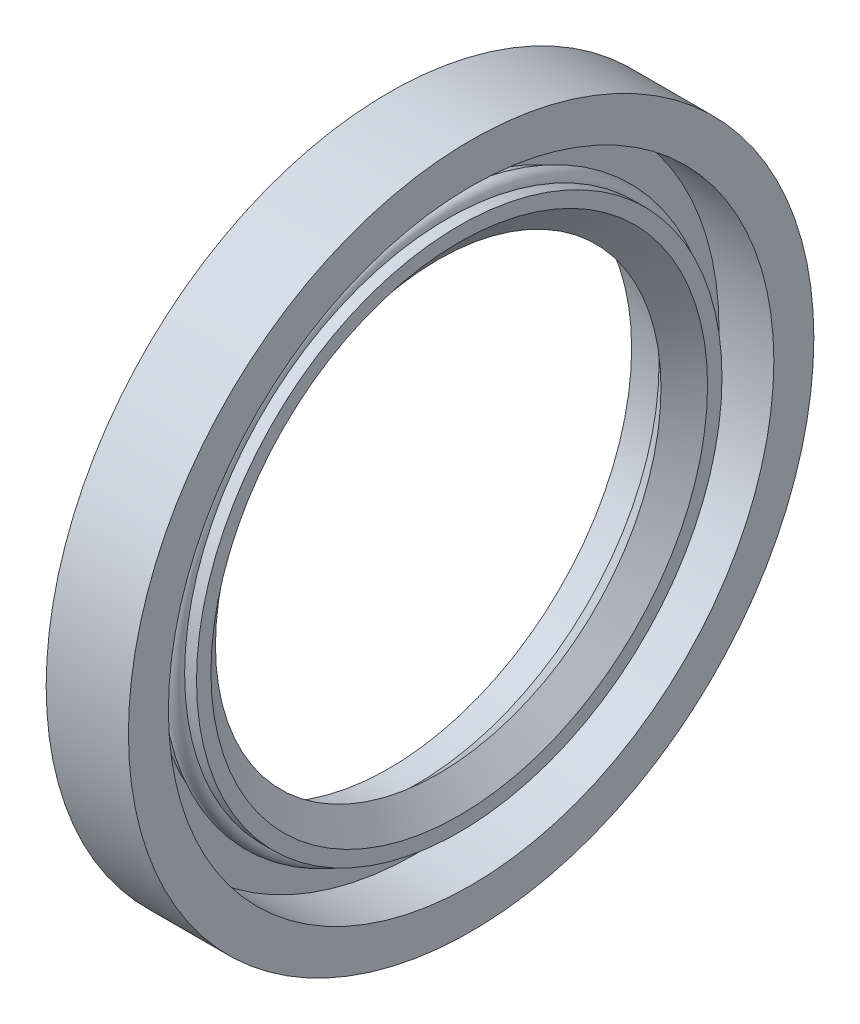
ISO-10303-21;
HEADER;
FILE_DESCRIPTION(('STEP AP214'),'2;1');
FILE_NAME('part.step','',(''),(''),'','','');
FILE_SCHEMA(('AUTOMOTIVE_DESIGN { 1 0 10303 214 1 1 1 1 }'));
ENDSEC;
DATA;
#1=APPLICATION_CONTEXT('core data for automotive mechanical design processes');
#2=APPLICATION_PROTOCOL_DEFINITION('international standard','automotive_design',2000,#1);
#3=PRODUCT_CONTEXT('',#1,'mechanical');
#4=PRODUCT('Part','Part','',(#3));
#5=PRODUCT_RELATED_PRODUCT_CATEGORY('part','',(#4));
#6=PRODUCT_DEFINITION_FORMATION('','',#4);
#7=PRODUCT_DEFINITION_CONTEXT('part definition',#1,'design');
#8=PRODUCT_DEFINITION('design','',#6,#7);
#9=PRODUCT_DEFINITION_SHAPE('','',#8);
#10=(LENGTH_UNIT() NAMED_UNIT(*) SI_UNIT(.MILLI.,.METRE.));
#11=(NAMED_UNIT(*) PLANE_ANGLE_UNIT() SI_UNIT($,.RADIAN.));
#12=(NAMED_UNIT(*) SI_UNIT($,.STERADIAN.) SOLID_ANGLE_UNIT());
#13=UNCERTAINTY_MEASURE_WITH_UNIT(LENGTH_MEASURE(1.E-05),#10,'distance_accuracy_value','');
#14=(GEOMETRIC_REPRESENTATION_CONTEXT(3) GLOBAL_UNCERTAINTY_ASSIGNED_CONTEXT((#13)) GLOBAL_UNIT_ASSIGNED_CONTEXT((#10,
#11,#12)) REPRESENTATION_CONTEXT('',''));
#15=CARTESIAN_POINT('',(0.,0.,0.));
#16=DIRECTION('',(0.,0.,1.));
#17=DIRECTION('',(1.,0.,0.));
#18=AXIS2_PLACEMENT_3D('',#15,#16,#17);
#19=CARTESIAN_POINT('',(12.,0.,0.));
#20=DIRECTION('',(1.,0.,0.));
#21=DIRECTION('',(0.,0.,-1.));
#22=AXIS2_PLACEMENT_3D('',#19,#20,#21);
#23=CYLINDRICAL_SURFACE('',#22,50.);
#24=CARTESIAN_POINT('',(0.,0.,0.));
#25=DIRECTION('',(1.,0.,0.));
#26=DIRECTION('',(0.,0.,-1.));
#27=AXIS2_PLACEMENT_3D('',#24,#25,#26);
#28=CIRCLE('',#27,50.);
#29=CARTESIAN_POINT('',(0.,0.,-50.));
#30=VERTEX_POINT('',#29);
#31=EDGE_CURVE('E56',#30,#30,#28,.T.);
#32=ORIENTED_EDGE('',*,*,#31,.T.);
#33=EDGE_LOOP('',(#32));
#34=FACE_BOUND('',#33,.T.);
#35=CARTESIAN_POINT('',(12.,0.,0.));
#36=DIRECTION('',(1.,0.,0.));
#37=DIRECTION('',(0.,0.,-1.));
#38=AXIS2_PLACEMENT_3D('',#35,#36,#37);
#39=CIRCLE('',#38,50.);
#40=CARTESIAN_POINT('',(12.,0.,-50.));
#41=VERTEX_POINT('',#40);
#42=EDGE_CURVE('E53',#41,#41,#39,.T.);
#43=ORIENTED_EDGE('',*,*,#42,.F.);
#44=EDGE_LOOP('',(#43));
#45=FACE_BOUND('',#44,.T.);
#46=ADVANCED_FACE('F15',(#34,#45),#23,.T.);
#47=CARTESIAN_POINT('',(0.,50.,0.));
#48=DIRECTION('',(-1.,0.,0.));
#49=DIRECTION('',(0.,0.,1.));
#50=AXIS2_PLACEMENT_3D('',#47,#48,#49);
#51=PLANE('',#50);
#52=CARTESIAN_POINT('',(0.,0.,0.));
#53=DIRECTION('',(1.,0.,0.));
#54=DIRECTION('',(0.,0.,-1.));
#55=AXIS2_PLACEMENT_3D('',#52,#53,#54);
#56=CIRCLE('',#55,35.416666666667);
#57=CARTESIAN_POINT('',(0.,0.,-35.416666666667));
#58=VERTEX_POINT('',#57);
#59=EDGE_CURVE('E50',#58,#58,#56,.T.);
#60=ORIENTED_EDGE('',*,*,#59,.T.);
#61=EDGE_LOOP('',(#60));
#62=FACE_BOUND('',#61,.T.);
#63=ORIENTED_EDGE('',*,*,#31,.F.);
#64=EDGE_LOOP('',(#63));
#65=FACE_BOUND('',#64,.T.);
#66=ADVANCED_FACE('F62',(#62,#65),#51,.T.);
#67=CARTESIAN_POINT('',(12.,44.166666666667,0.));
#68=DIRECTION('',(1.,0.,0.));
#69=DIRECTION('',(0.,0.,-1.));
#70=AXIS2_PLACEMENT_3D('',#67,#68,#69);
#71=PLANE('',#70);
#72=ORIENTED_EDGE('',*,*,#42,.T.);
#73=EDGE_LOOP('',(#72));
#74=FACE_BOUND('',#73,.T.);
#75=CARTESIAN_POINT('',(12.,0.,0.));
#76=DIRECTION('',(1.,0.,0.));
#77=DIRECTION('',(0.,0.,-1.));
#78=AXIS2_PLACEMENT_3D('',#75,#76,#77);
#79=CIRCLE('',#78,44.166666666667);
#80=CARTESIAN_POINT('',(12.,0.,-44.166666666667));
#81=VERTEX_POINT('',#80);
#82=EDGE_CURVE('E47',#81,#81,#79,.T.);
#83=ORIENTED_EDGE('',*,*,#82,.F.);
#84=EDGE_LOOP('',(#83));
#85=FACE_BOUND('',#84,.T.);
#86=ADVANCED_FACE('F64',(#74,#85),#71,.T.);
#87=CARTESIAN_POINT('',(12.,0.,0.));
#88=DIRECTION('',(1.,0.,0.));
#89=DIRECTION('',(0.,0.,-1.));
#90=AXIS2_PLACEMENT_3D('',#87,#88,#89);
#91=CYLINDRICAL_SURFACE('',#90,35.416666666667);
#92=CARTESIAN_POINT('',(4.,0.,0.));
#93=DIRECTION('',(1.,0.,0.));
#94=DIRECTION('',(0.,0.,-1.));
#95=AXIS2_PLACEMENT_3D('',#92,#93,#94);
#96=CIRCLE('',#95,35.416666666667);
#97=CARTESIAN_POINT('',(4.,0.,-35.416666666667));
#98=VERTEX_POINT('',#97);
#99=EDGE_CURVE('E44',#98,#98,#96,.T.);
#100=ORIENTED_EDGE('',*,*,#99,.T.);
#101=EDGE_LOOP('',(#100));
#102=FACE_BOUND('',#101,.T.);
#103=ORIENTED_EDGE('',*,*,#59,.F.);
#104=EDGE_LOOP('',(#103));
#105=FACE_BOUND('',#104,.T.);
#106=ADVANCED_FACE('F72',(#102,#105),#91,.F.);
#107=CARTESIAN_POINT('',(12.,0.,0.));
#108=DIRECTION('',(1.,0.,0.));
#109=DIRECTION('',(0.,0.,-1.));
#110=AXIS2_PLACEMENT_3D('',#107,#108,#109);
#111=CYLINDRICAL_SURFACE('',#110,44.166666666667);
#112=ORIENTED_EDGE('',*,*,#82,.T.);
#113=EDGE_LOOP('',(#112));
#114=FACE_BOUND('',#113,.T.);
#115=CARTESIAN_POINT('',(4.,0.,0.));
#116=DIRECTION('',(1.,0.,0.));
#117=DIRECTION('',(0.,0.,-1.));
#118=AXIS2_PLACEMENT_3D('',#115,#116,#117);
#119=CIRCLE('',#118,44.166666666667);
#120=CARTESIAN_POINT('',(4.,0.,-44.166666666667));
#121=VERTEX_POINT('',#120);
#122=EDGE_CURVE('E41',#121,#121,#119,.T.);
#123=ORIENTED_EDGE('',*,*,#122,.F.);
#124=EDGE_LOOP('',(#123));
#125=FACE_BOUND('',#124,.T.);
#126=ADVANCED_FACE('F79',(#114,#125),#111,.F.);
#127=CARTESIAN_POINT('',(4.,0.,0.));
#128=DIRECTION('',(-1.,0.,0.));
#129=DIRECTION('',(0.,0.,1.));
#130=AXIS2_PLACEMENT_3D('',#127,#128,#129);
#131=CONICAL_SURFACE('',#130,35.416666666667,0.739109725373345);
#132=CARTESIAN_POINT('',(7.2,0.,0.));
#133=DIRECTION('',(1.,0.,0.));
#134=DIRECTION('',(0.,0.,-1.));
#135=AXIS2_PLACEMENT_3D('',#132,#133,#134);
#136=CIRCLE('',#135,32.5);
#137=CARTESIAN_POINT('',(7.2,0.,-32.5));
#138=VERTEX_POINT('',#137);
#139=EDGE_CURVE('E38',#138,#138,#136,.T.);
#140=ORIENTED_EDGE('',*,*,#139,.T.);
#141=EDGE_LOOP('',(#140));
#142=FACE_BOUND('',#141,.T.);
#143=ORIENTED_EDGE('',*,*,#99,.F.);
#144=EDGE_LOOP('',(#143));
#145=FACE_BOUND('',#144,.T.);
#146=ADVANCED_FACE('F83',(#142,#145),#131,.F.);
#147=CARTESIAN_POINT('',(4.,38.333333333333,0.));
#148=DIRECTION('',(1.,0.,0.));
#149=DIRECTION('',(0.,0.,-1.));
#150=AXIS2_PLACEMENT_3D('',#147,#148,#149);
#151=PLANE('',#150);
#152=ORIENTED_EDGE('',*,*,#122,.T.);
#153=EDGE_LOOP('',(#152));
#154=FACE_BOUND('',#153,.T.);
#155=CARTESIAN_POINT('',(4.,0.,0.));
#156=DIRECTION('',(1.,0.,0.));
#157=DIRECTION('',(0.,0.,-1.));
#158=AXIS2_PLACEMENT_3D('',#155,#156,#157);
#159=CIRCLE('',#158,38.333333333333);
#160=CARTESIAN_POINT('',(4.,0.,-38.333333333333));
#161=VERTEX_POINT('',#160);
#162=EDGE_CURVE('E35',#161,#161,#159,.T.);
#163=ORIENTED_EDGE('',*,*,#162,.F.);
#164=EDGE_LOOP('',(#163));
#165=FACE_BOUND('',#164,.T.);
#166=ADVANCED_FACE('F87',(#154,#165),#151,.T.);
#167=CARTESIAN_POINT('',(7.2,0.,0.));
#168=DIRECTION('',(1.,0.,0.));
#169=DIRECTION('',(0.,0.,-1.));
#170=AXIS2_PLACEMENT_3D('',#167,#168,#169);
#171=CONICAL_SURFACE('',#170,32.5,0.882272659856982);
#172=CARTESIAN_POINT('',(10.2666665,0.,0.));
#173=DIRECTION('',(1.,0.,0.));
#174=DIRECTION('',(0.,0.,-1.));
#175=AXIS2_PLACEMENT_3D('',#172,#173,#174);
#176=CIRCLE('',#175,36.226851649306);
#177=CARTESIAN_POINT('',(10.2666665,0.,-36.226851649306));
#178=VERTEX_POINT('',#177);
#179=EDGE_CURVE('E30',#178,#178,#176,.T.);
#180=ORIENTED_EDGE('',*,*,#179,.T.);
#181=EDGE_LOOP('',(#180));
#182=FACE_BOUND('',#181,.T.);
#183=ORIENTED_EDGE('',*,*,#139,.F.);
#184=EDGE_LOOP('',(#183));
#185=FACE_BOUND('',#184,.T.);
#186=ADVANCED_FACE('F91',(#182,#185),#171,.F.);
#187=CARTESIAN_POINT('',(12.,0.,0.));
#188=DIRECTION('',(1.,0.,0.));
#189=DIRECTION('',(0.,0.,-1.));
#190=AXIS2_PLACEMENT_3D('',#187,#188,#189);
#191=CYLINDRICAL_SURFACE('',#190,38.333333333333);
#192=ORIENTED_EDGE('',*,*,#162,.T.);
#193=EDGE_LOOP('',(#192));
#194=FACE_BOUND('',#193,.T.);
#195=CARTESIAN_POINT('',(5.866667,0.,0.));
#196=DIRECTION('',(1.,0.,0.));
#197=DIRECTION('',(0.,0.,-1.));
#198=AXIS2_PLACEMENT_3D('',#195,#196,#197);
#199=CIRCLE('',#198,38.333333333333);
#200=CARTESIAN_POINT('',(5.866667,0.,-38.333333333333));
#201=VERTEX_POINT('',#200);
#202=EDGE_CURVE('E26',#201,#201,#199,.T.);
#203=ORIENTED_EDGE('',*,*,#202,.F.);
#204=EDGE_LOOP('',(#203));
#205=FACE_BOUND('',#204,.T.);
#206=ADVANCED_FACE('F95',(#194,#205),#191,.T.);
#207=CARTESIAN_POINT('',(10.2666665,36.226851649306,0.));
#208=DIRECTION('',(1.,0.,0.));
#209=DIRECTION('',(0.,0.,-1.));
#210=AXIS2_PLACEMENT_3D('',#207,#208,#209);
#211=PLANE('',#210);
#212=CARTESIAN_POINT('',(10.2666665,0.,0.));
#213=DIRECTION('',(1.,0.,0.));
#214=DIRECTION('',(0.,0.,-1.));
#215=AXIS2_PLACEMENT_3D('',#212,#213,#214);
#216=CIRCLE('',#215,38.333333333333);
#217=CARTESIAN_POINT('',(10.2666665,0.,-38.333333333333));
#218=VERTEX_POINT('',#217);
#219=EDGE_CURVE('E22',#218,#218,#216,.T.);
#220=ORIENTED_EDGE('',*,*,#219,.T.);
#221=EDGE_LOOP('',(#220));
#222=FACE_BOUND('',#221,.T.);
#223=ORIENTED_EDGE('',*,*,#179,.F.);
#224=EDGE_LOOP('',(#223));
#225=FACE_BOUND('',#224,.T.);
#226=ADVANCED_FACE('F99',(#222,#225),#211,.T.);
#227=CARTESIAN_POINT('',(7.2,0.,0.));
#228=DIRECTION('',(1.,0.,0.));
#229=DIRECTION('',(0.,0.,-1.));
#230=AXIS2_PLACEMENT_3D('',#227,#228,#229);
#231=TOROIDAL_SURFACE('',#230,38.333333333333,1.333333);
#232=ORIENTED_EDGE('',*,*,#202,.T.);
#233=EDGE_LOOP('',(#232));
#234=FACE_BOUND('',#233,.T.);
#235=CARTESIAN_POINT('',(8.533333,0.,0.));
#236=DIRECTION('',(1.,0.,0.));
#237=DIRECTION('',(0.,0.,-1.));
#238=AXIS2_PLACEMENT_3D('',#235,#236,#237);
#239=CIRCLE('',#238,38.333333333333);
#240=CARTESIAN_POINT('',(8.533333,0.,-38.333333333333));
#241=VERTEX_POINT('',#240);
#242=EDGE_CURVE('E10',#241,#241,#239,.T.);
#243=ORIENTED_EDGE('',*,*,#242,.F.);
#244=EDGE_LOOP('',(#243));
#245=FACE_BOUND('',#244,.T.);
#246=ADVANCED_FACE('F102',(#234,#245),#231,.T.);
#247=CARTESIAN_POINT('',(12.,0.,0.));
#248=DIRECTION('',(1.,0.,0.));
#249=DIRECTION('',(0.,0.,-1.));
#250=AXIS2_PLACEMENT_3D('',#247,#248,#249);
#251=CYLINDRICAL_SURFACE('',#250,38.333333333333);
#252=ORIENTED_EDGE('',*,*,#242,.T.);
#253=EDGE_LOOP('',(#252));
#254=FACE_BOUND('',#253,.T.);
#255=ORIENTED_EDGE('',*,*,#219,.F.);
#256=EDGE_LOOP('',(#255));
#257=FACE_BOUND('',#256,.T.);
#258=ADVANCED_FACE('F17',(#254,#257),#251,.T.);
#259=CLOSED_SHELL('',(#46,#66,#86,#106,#126,#146,#166,#186,#206,#226,#246,#258));
#260=MANIFOLD_SOLID_BREP('B1',#259);
#261=ADVANCED_BREP_SHAPE_REPRESENTATION('',(#18,#260),#14);
#262=SHAPE_DEFINITION_REPRESENTATION(#9,#261);
ENDSEC;
END-ISO-10303-21;
